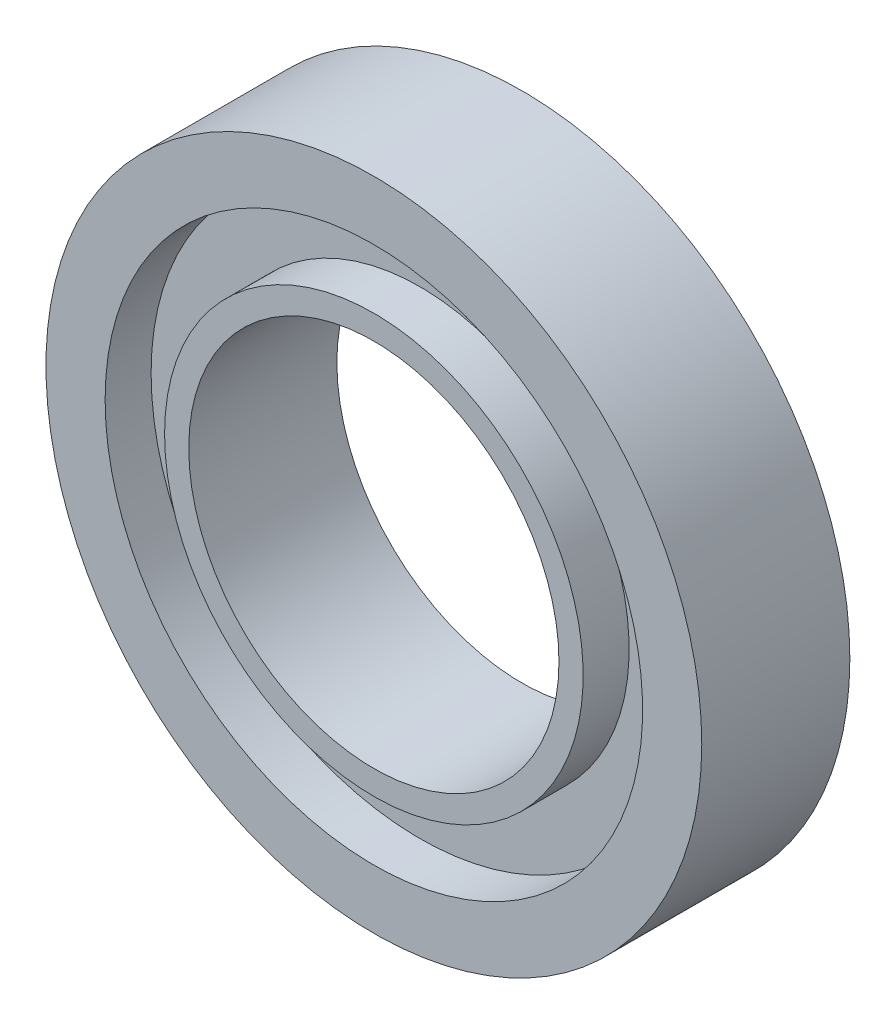
ISO-10303-21;
HEADER;
FILE_DESCRIPTION(('STEP AP214'),'2;1');
FILE_NAME('part.step','',(''),(''),'','','');
FILE_SCHEMA(('AUTOMOTIVE_DESIGN { 1 0 10303 214 1 1 1 1 }'));
ENDSEC;
DATA;
#1=APPLICATION_CONTEXT('core data for automotive mechanical design processes');
#2=APPLICATION_PROTOCOL_DEFINITION('international standard','automotive_design',2000,#1);
#3=PRODUCT_CONTEXT('',#1,'mechanical');
#4=PRODUCT('Part','Part','',(#3));
#5=PRODUCT_RELATED_PRODUCT_CATEGORY('part','',(#4));
#6=PRODUCT_DEFINITION_FORMATION('','',#4);
#7=PRODUCT_DEFINITION_CONTEXT('part definition',#1,'design');
#8=PRODUCT_DEFINITION('design','',#6,#7);
#9=PRODUCT_DEFINITION_SHAPE('','',#8);
#10=(LENGTH_UNIT() NAMED_UNIT(*) SI_UNIT(.MILLI.,.METRE.));
#11=(NAMED_UNIT(*) PLANE_ANGLE_UNIT() SI_UNIT($,.RADIAN.));
#12=(NAMED_UNIT(*) SI_UNIT($,.STERADIAN.) SOLID_ANGLE_UNIT());
#13=UNCERTAINTY_MEASURE_WITH_UNIT(LENGTH_MEASURE(1.E-05),#10,'distance_accuracy_value','');
#14=(GEOMETRIC_REPRESENTATION_CONTEXT(3) GLOBAL_UNCERTAINTY_ASSIGNED_CONTEXT((#13)) GLOBAL_UNIT_ASSIGNED_CONTEXT((#10,
#11,#12)) REPRESENTATION_CONTEXT('',''));
#15=CARTESIAN_POINT('',(0.,0.,0.));
#16=DIRECTION('',(0.,0.,1.));
#17=DIRECTION('',(1.,0.,0.));
#18=AXIS2_PLACEMENT_3D('',#15,#16,#17);
#19=CARTESIAN_POINT('',(0.,0.,7.));
#20=DIRECTION('',(0.,0.,1.));
#21=DIRECTION('',(1.,0.,0.));
#22=AXIS2_PLACEMENT_3D('',#19,#20,#21);
#23=PLANE('',#22);
#24=CARTESIAN_POINT('',(0.,0.,7.));
#25=DIRECTION('',(0.,0.,-1.));
#26=DIRECTION('',(-1.,0.,0.));
#27=AXIS2_PLACEMENT_3D('',#24,#25,#26);
#28=CIRCLE('',#27,19.7859378345638);
#29=CARTESIAN_POINT('',(-19.7859378345638,0.,7.));
#30=VERTEX_POINT('',#29);
#31=EDGE_CURVE('E78',#30,#30,#28,.T.);
#32=ORIENTED_EDGE('',*,*,#31,.F.);
#33=EDGE_LOOP('',(#32));
#34=FACE_BOUND('',#33,.T.);
#35=CARTESIAN_POINT('',(0.,0.,7.));
#36=DIRECTION('',(0.,0.,1.));
#37=DIRECTION('',(1.,0.,0.));
#38=AXIS2_PLACEMENT_3D('',#35,#36,#37);
#39=CIRCLE('',#38,17.5);
#40=CARTESIAN_POINT('',(17.5,0.,7.));
#41=VERTEX_POINT('',#40);
#42=EDGE_CURVE('E50',#41,#41,#39,.T.);
#43=ORIENTED_EDGE('',*,*,#42,.F.);
#44=EDGE_LOOP('',(#43));
#45=FACE_BOUND('',#44,.T.);
#46=ADVANCED_FACE('F39',(#34,#45),#23,.T.);
#47=CARTESIAN_POINT('',(0.,0.,-7.));
#48=DIRECTION('',(0.,0.,1.));
#49=DIRECTION('',(1.,0.,0.));
#50=AXIS2_PLACEMENT_3D('',#47,#48,#49);
#51=PLANE('',#50);
#52=CARTESIAN_POINT('',(0.,0.,-7.));
#53=DIRECTION('',(0.,0.,-1.));
#54=DIRECTION('',(-1.,0.,0.));
#55=AXIS2_PLACEMENT_3D('',#52,#53,#54);
#56=CIRCLE('',#55,19.7859378345638);
#57=CARTESIAN_POINT('',(-19.7859378345638,0.,-7.));
#58=VERTEX_POINT('',#57);
#59=EDGE_CURVE('E66',#58,#58,#56,.T.);
#60=ORIENTED_EDGE('',*,*,#59,.T.);
#61=EDGE_LOOP('',(#60));
#62=FACE_BOUND('',#61,.T.);
#63=CARTESIAN_POINT('',(0.,0.,-7.));
#64=DIRECTION('',(0.,0.,1.));
#65=DIRECTION('',(1.,0.,0.));
#66=AXIS2_PLACEMENT_3D('',#63,#64,#65);
#67=CIRCLE('',#66,17.5);
#68=CARTESIAN_POINT('',(17.5,0.,-7.));
#69=VERTEX_POINT('',#68);
#70=EDGE_CURVE('E52',#69,#69,#67,.T.);
#71=ORIENTED_EDGE('',*,*,#70,.T.);
#72=EDGE_LOOP('',(#71));
#73=FACE_BOUND('',#72,.T.);
#74=ADVANCED_FACE('F86',(#62,#73),#51,.F.);
#75=CARTESIAN_POINT('',(0.,0.,7.));
#76=DIRECTION('',(0.,0.,-1.));
#77=DIRECTION('',(-1.,0.,0.));
#78=AXIS2_PLACEMENT_3D('',#75,#76,#77);
#79=CIRCLE('',#78,25.4069429012012);
#80=CARTESIAN_POINT('',(-25.4069429012012,0.,7.));
#81=VERTEX_POINT('',#80);
#82=EDGE_CURVE('E75',#81,#81,#79,.T.);
#83=ORIENTED_EDGE('',*,*,#82,.T.);
#84=EDGE_LOOP('',(#83));
#85=FACE_BOUND('',#84,.T.);
#86=CARTESIAN_POINT('',(0.,0.,7.));
#87=DIRECTION('',(0.,0.,1.));
#88=DIRECTION('',(1.,0.,0.));
#89=AXIS2_PLACEMENT_3D('',#86,#87,#88);
#90=CIRCLE('',#89,31.);
#91=CARTESIAN_POINT('',(31.,0.,7.));
#92=VERTEX_POINT('',#91);
#93=EDGE_CURVE('E10',#92,#92,#90,.T.);
#94=ORIENTED_EDGE('',*,*,#93,.T.);
#95=EDGE_LOOP('',(#94));
#96=FACE_BOUND('',#95,.T.);
#97=ADVANCED_FACE('F88',(#85,#96),#23,.T.);
#98=CARTESIAN_POINT('',(0.,0.,-7.));
#99=DIRECTION('',(0.,0.,-1.));
#100=DIRECTION('',(-1.,0.,0.));
#101=AXIS2_PLACEMENT_3D('',#98,#99,#100);
#102=CIRCLE('',#101,25.4069429012012);
#103=CARTESIAN_POINT('',(-25.4069429012012,0.,-7.));
#104=VERTEX_POINT('',#103);
#105=EDGE_CURVE('E63',#104,#104,#102,.T.);
#106=ORIENTED_EDGE('',*,*,#105,.F.);
#107=EDGE_LOOP('',(#106));
#108=FACE_BOUND('',#107,.T.);
#109=CARTESIAN_POINT('',(0.,0.,-7.));
#110=DIRECTION('',(0.,0.,1.));
#111=DIRECTION('',(1.,0.,0.));
#112=AXIS2_PLACEMENT_3D('',#109,#110,#111);
#113=CIRCLE('',#112,31.);
#114=CARTESIAN_POINT('',(31.,0.,-7.));
#115=VERTEX_POINT('',#114);
#116=EDGE_CURVE('E43',#115,#115,#113,.T.);
#117=ORIENTED_EDGE('',*,*,#116,.F.);
#118=EDGE_LOOP('',(#117));
#119=FACE_BOUND('',#118,.T.);
#120=ADVANCED_FACE('F100',(#108,#119),#51,.F.);
#121=CARTESIAN_POINT('',(0.,0.,7.));
#122=DIRECTION('',(0.,0.,-1.));
#123=DIRECTION('',(-1.,0.,0.));
#124=AXIS2_PLACEMENT_3D('',#121,#122,#123);
#125=CYLINDRICAL_SURFACE('',#124,31.);
#126=ORIENTED_EDGE('',*,*,#93,.F.);
#127=EDGE_LOOP('',(#126));
#128=FACE_BOUND('',#127,.T.);
#129=ORIENTED_EDGE('',*,*,#116,.T.);
#130=EDGE_LOOP('',(#129));
#131=FACE_BOUND('',#130,.T.);
#132=ADVANCED_FACE('F41',(#128,#131),#125,.T.);
#133=CARTESIAN_POINT('',(0.,0.,7.));
#134=DIRECTION('',(0.,0.,-1.));
#135=DIRECTION('',(-1.,0.,0.));
#136=AXIS2_PLACEMENT_3D('',#133,#134,#135);
#137=CYLINDRICAL_SURFACE('',#136,17.5);
#138=ORIENTED_EDGE('',*,*,#42,.T.);
#139=EDGE_LOOP('',(#138));
#140=FACE_BOUND('',#139,.T.);
#141=ORIENTED_EDGE('',*,*,#70,.F.);
#142=EDGE_LOOP('',(#141));
#143=FACE_BOUND('',#142,.T.);
#144=ADVANCED_FACE('F91',(#140,#143),#137,.F.);
#145=CARTESIAN_POINT('',(0.,0.,-7.));
#146=DIRECTION('',(0.,0.,-1.));
#147=DIRECTION('',(-1.,0.,0.));
#148=AXIS2_PLACEMENT_3D('',#145,#146,#147);
#149=CYLINDRICAL_SURFACE('',#148,19.7859378345638);
#150=CARTESIAN_POINT('',(0.,0.,-2.65311439145287));
#151=DIRECTION('',(0.,0.,-1.));
#152=DIRECTION('',(-1.,0.,0.));
#153=AXIS2_PLACEMENT_3D('',#150,#151,#152);
#154=CIRCLE('',#153,19.7859378345638);
#155=CARTESIAN_POINT('',(-19.7859378345638,0.,-2.65311439145287));
#156=VERTEX_POINT('',#155);
#157=EDGE_CURVE('E55',#156,#156,#154,.T.);
#158=ORIENTED_EDGE('',*,*,#157,.T.);
#159=EDGE_LOOP('',(#158));
#160=FACE_BOUND('',#159,.T.);
#161=ORIENTED_EDGE('',*,*,#59,.F.);
#162=EDGE_LOOP('',(#161));
#163=FACE_BOUND('',#162,.T.);
#164=ADVANCED_FACE('F94',(#160,#163),#149,.T.);
#165=CARTESIAN_POINT('',(19.7859378345638,0.,-2.65311439145287));
#166=DIRECTION('',(0.,0.,-1.));
#167=DIRECTION('',(-1.,0.,0.));
#168=AXIS2_PLACEMENT_3D('',#165,#166,#167);
#169=PLANE('',#168);
#170=CARTESIAN_POINT('',(0.,0.,-2.65311439145287));
#171=DIRECTION('',(0.,0.,-1.));
#172=DIRECTION('',(-1.,0.,0.));
#173=AXIS2_PLACEMENT_3D('',#170,#171,#172);
#174=CIRCLE('',#173,25.4069429012012);
#175=CARTESIAN_POINT('',(-25.4069429012012,0.,-2.65311439145287));
#176=VERTEX_POINT('',#175);
#177=EDGE_CURVE('E60',#176,#176,#174,.T.);
#178=ORIENTED_EDGE('',*,*,#177,.T.);
#179=EDGE_LOOP('',(#178));
#180=FACE_BOUND('',#179,.T.);
#181=ORIENTED_EDGE('',*,*,#157,.F.);
#182=EDGE_LOOP('',(#181));
#183=FACE_BOUND('',#182,.T.);
#184=ADVANCED_FACE('F120',(#180,#183),#169,.T.);
#185=CARTESIAN_POINT('',(0.,0.,-7.));
#186=DIRECTION('',(0.,0.,-1.));
#187=DIRECTION('',(-1.,0.,0.));
#188=AXIS2_PLACEMENT_3D('',#185,#186,#187);
#189=CYLINDRICAL_SURFACE('',#188,25.4069429012012);
#190=ORIENTED_EDGE('',*,*,#105,.T.);
#191=EDGE_LOOP('',(#190));
#192=FACE_BOUND('',#191,.T.);
#193=ORIENTED_EDGE('',*,*,#177,.F.);
#194=EDGE_LOOP('',(#193));
#195=FACE_BOUND('',#194,.T.);
#196=ADVANCED_FACE('F117',(#192,#195),#189,.F.);
#197=CARTESIAN_POINT('',(0.,0.,7.));
#198=DIRECTION('',(0.,0.,1.));
#199=DIRECTION('',(-1.,0.,0.));
#200=AXIS2_PLACEMENT_3D('',#197,#198,#199);
#201=CYLINDRICAL_SURFACE('',#200,19.7859378345638);
#202=CARTESIAN_POINT('',(0.,0.,2.65311439145287));
#203=DIRECTION('',(0.,0.,-1.));
#204=DIRECTION('',(-1.,0.,0.));
#205=AXIS2_PLACEMENT_3D('',#202,#203,#204);
#206=CIRCLE('',#205,19.7859378345638);
#207=CARTESIAN_POINT('',(-19.7859378345638,0.,2.65311439145287));
#208=VERTEX_POINT('',#207);
#209=EDGE_CURVE('E69',#208,#208,#206,.T.);
#210=ORIENTED_EDGE('',*,*,#209,.F.);
#211=EDGE_LOOP('',(#210));
#212=FACE_BOUND('',#211,.T.);
#213=ORIENTED_EDGE('',*,*,#31,.T.);
#214=EDGE_LOOP('',(#213));
#215=FACE_BOUND('',#214,.T.);
#216=ADVANCED_FACE('F82',(#212,#215),#201,.T.);
#217=CARTESIAN_POINT('',(19.7859378345638,0.,2.65311439145287));
#218=DIRECTION('',(0.,0.,1.));
#219=DIRECTION('',(-1.,0.,0.));
#220=AXIS2_PLACEMENT_3D('',#217,#218,#219);
#221=PLANE('',#220);
#222=CARTESIAN_POINT('',(0.,0.,2.65311439145287));
#223=DIRECTION('',(0.,0.,-1.));
#224=DIRECTION('',(-1.,0.,0.));
#225=AXIS2_PLACEMENT_3D('',#222,#223,#224);
#226=CIRCLE('',#225,25.4069429012012);
#227=CARTESIAN_POINT('',(-25.4069429012012,0.,2.65311439145287));
#228=VERTEX_POINT('',#227);
#229=EDGE_CURVE('E72',#228,#228,#226,.T.);
#230=ORIENTED_EDGE('',*,*,#229,.F.);
#231=EDGE_LOOP('',(#230));
#232=FACE_BOUND('',#231,.T.);
#233=ORIENTED_EDGE('',*,*,#209,.T.);
#234=EDGE_LOOP('',(#233));
#235=FACE_BOUND('',#234,.T.);
#236=ADVANCED_FACE('F137',(#232,#235),#221,.T.);
#237=CARTESIAN_POINT('',(0.,0.,7.));
#238=DIRECTION('',(0.,0.,1.));
#239=DIRECTION('',(-1.,0.,0.));
#240=AXIS2_PLACEMENT_3D('',#237,#238,#239);
#241=CYLINDRICAL_SURFACE('',#240,25.4069429012012);
#242=ORIENTED_EDGE('',*,*,#82,.F.);
#243=EDGE_LOOP('',(#242));
#244=FACE_BOUND('',#243,.T.);
#245=ORIENTED_EDGE('',*,*,#229,.T.);
#246=EDGE_LOOP('',(#245));
#247=FACE_BOUND('',#246,.T.);
#248=ADVANCED_FACE('F141',(#244,#247),#241,.F.);
#249=CLOSED_SHELL('',(#46,#74,#97,#120,#132,#144,#164,#184,#196,#216,#236,#248));
#250=MANIFOLD_SOLID_BREP('B2',#249);
#251=ADVANCED_BREP_SHAPE_REPRESENTATION('',(#18,#250),#14);
#252=SHAPE_DEFINITION_REPRESENTATION(#9,#251);
ENDSEC;
END-ISO-10303-21;
